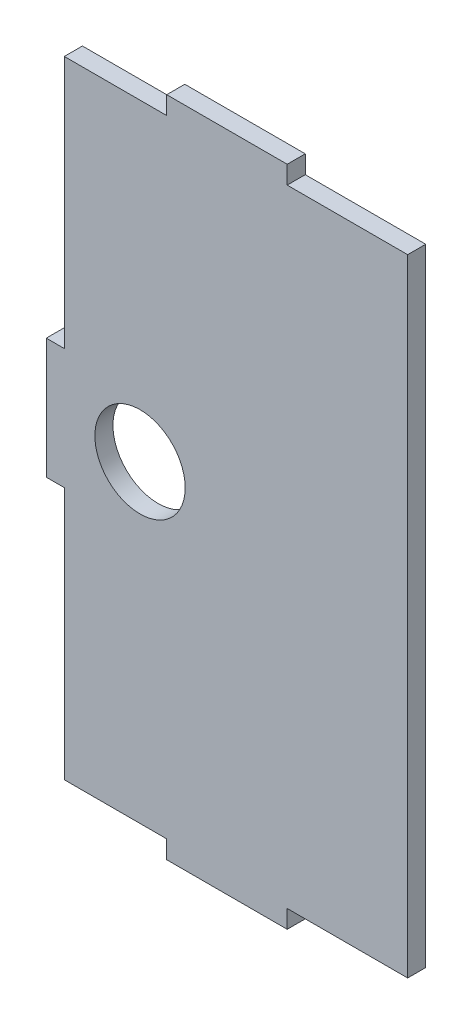
ISO-10303-21;
HEADER;
FILE_DESCRIPTION(('STEP AP214'),'2;1');
FILE_NAME('part.step','',(''),(''),'','','');
FILE_SCHEMA(('AUTOMOTIVE_DESIGN { 1 0 10303 214 1 1 1 1 }'));
ENDSEC;
DATA;
#1=APPLICATION_CONTEXT('core data for automotive mechanical design processes');
#2=APPLICATION_PROTOCOL_DEFINITION('international standard','automotive_design',2000,#1);
#3=PRODUCT_CONTEXT('',#1,'mechanical');
#4=PRODUCT('Part','Part','',(#3));
#5=PRODUCT_RELATED_PRODUCT_CATEGORY('part','',(#4));
#6=PRODUCT_DEFINITION_FORMATION('','',#4);
#7=PRODUCT_DEFINITION_CONTEXT('part definition',#1,'design');
#8=PRODUCT_DEFINITION('design','',#6,#7);
#9=PRODUCT_DEFINITION_SHAPE('','',#8);
#10=(LENGTH_UNIT() NAMED_UNIT(*) SI_UNIT(.MILLI.,.METRE.));
#11=(NAMED_UNIT(*) PLANE_ANGLE_UNIT() SI_UNIT($,.RADIAN.));
#12=(NAMED_UNIT(*) SI_UNIT($,.STERADIAN.) SOLID_ANGLE_UNIT());
#13=UNCERTAINTY_MEASURE_WITH_UNIT(LENGTH_MEASURE(1.E-05),#10,'distance_accuracy_value','');
#14=(GEOMETRIC_REPRESENTATION_CONTEXT(3) GLOBAL_UNCERTAINTY_ASSIGNED_CONTEXT((#13)) GLOBAL_UNIT_ASSIGNED_CONTEXT((#10,
#11,#12)) REPRESENTATION_CONTEXT('',''));
#15=CARTESIAN_POINT('',(0.,0.,0.));
#16=DIRECTION('',(0.,0.,1.));
#17=DIRECTION('',(1.,0.,0.));
#18=AXIS2_PLACEMENT_3D('',#15,#16,#17);
#19=CARTESIAN_POINT('',(-27.,52.,3.));
#20=DIRECTION('',(1.,0.,0.));
#21=DIRECTION('',(0.,1.,0.));
#22=AXIS2_PLACEMENT_3D('',#19,#20,#21);
#23=PLANE('',#22);
#24=DIRECTION('',(0.,0.,1.));
#25=VECTOR('',#24,1.);
#26=CARTESIAN_POINT('',(-27.,-10.,0.));
#27=LINE('',#26,#25);
#28=CARTESIAN_POINT('',(-27.,-10.,0.));
#29=VERTEX_POINT('',#28);
#30=CARTESIAN_POINT('',(-27.,-10.,3.));
#31=VERTEX_POINT('',#30);
#32=EDGE_CURVE('E166',#29,#31,#27,.T.);
#33=ORIENTED_EDGE('',*,*,#32,.F.);
#34=DIRECTION('',(0.,-1.,0.));
#35=VECTOR('',#34,1.);
#36=CARTESIAN_POINT('',(-27.,52.,0.));
#37=LINE('',#36,#35);
#38=CARTESIAN_POINT('',(-27.,-52.,0.));
#39=VERTEX_POINT('',#38);
#40=EDGE_CURVE('E235',#29,#39,#37,.T.);
#41=ORIENTED_EDGE('',*,*,#40,.T.);
#42=DIRECTION('',(0.,0.,-1.));
#43=VECTOR('',#42,1.);
#44=CARTESIAN_POINT('',(-27.,-52.,3.));
#45=LINE('',#44,#43);
#46=CARTESIAN_POINT('',(-27.,-52.,3.));
#47=VERTEX_POINT('',#46);
#48=EDGE_CURVE('E246',#47,#39,#45,.T.);
#49=ORIENTED_EDGE('',*,*,#48,.F.);
#50=DIRECTION('',(0.,-1.,0.));
#51=VECTOR('',#50,1.);
#52=CARTESIAN_POINT('',(-27.,52.,3.));
#53=LINE('',#52,#51);
#54=EDGE_CURVE('E48',#31,#47,#53,.T.);
#55=ORIENTED_EDGE('',*,*,#54,.F.);
#56=EDGE_LOOP('',(#33,#41,#49,#55));
#57=FACE_BOUND('',#56,.T.);
#58=ADVANCED_FACE('F32',(#57),#23,.F.);
#59=DIRECTION('',(0.,0.,-1.));
#60=VECTOR('',#59,1.);
#61=CARTESIAN_POINT('',(-27.,9.99999999999999,0.));
#62=LINE('',#61,#60);
#63=CARTESIAN_POINT('',(-27.,9.99999999999999,3.));
#64=VERTEX_POINT('',#63);
#65=CARTESIAN_POINT('',(-27.,9.99999999999999,0.));
#66=VERTEX_POINT('',#65);
#67=EDGE_CURVE('E56',#64,#66,#62,.T.);
#68=ORIENTED_EDGE('',*,*,#67,.F.);
#69=CARTESIAN_POINT('',(-27.,52.,3.));
#70=VERTEX_POINT('',#69);
#71=EDGE_CURVE('E171',#70,#64,#53,.T.);
#72=ORIENTED_EDGE('',*,*,#71,.F.);
#73=DIRECTION('',(0.,0.,-1.));
#74=VECTOR('',#73,1.);
#75=CARTESIAN_POINT('',(-27.,52.,3.));
#76=LINE('',#75,#74);
#77=CARTESIAN_POINT('',(-27.,52.,0.));
#78=VERTEX_POINT('',#77);
#79=EDGE_CURVE('E249',#70,#78,#76,.T.);
#80=ORIENTED_EDGE('',*,*,#79,.T.);
#81=EDGE_CURVE('E236',#78,#66,#37,.T.);
#82=ORIENTED_EDGE('',*,*,#81,.T.);
#83=EDGE_LOOP('',(#68,#72,#80,#82));
#84=FACE_BOUND('',#83,.T.);
#85=ADVANCED_FACE('F334',(#84),#23,.F.);
#86=CARTESIAN_POINT('',(-10.,-55.,3.));
#87=DIRECTION('',(0.,1.,0.));
#88=DIRECTION('',(0.,0.,1.));
#89=AXIS2_PLACEMENT_3D('',#86,#87,#88);
#90=PLANE('',#89);
#91=DIRECTION('',(1.,0.,0.));
#92=VECTOR('',#91,1.);
#93=CARTESIAN_POINT('',(-10.,-55.,0.));
#94=LINE('',#93,#92);
#95=CARTESIAN_POINT('',(-10.,-55.,0.));
#96=VERTEX_POINT('',#95);
#97=CARTESIAN_POINT('',(10.,-55.,0.));
#98=VERTEX_POINT('',#97);
#99=EDGE_CURVE('E210',#96,#98,#94,.T.);
#100=ORIENTED_EDGE('',*,*,#99,.T.);
#101=DIRECTION('',(0.,0.,-1.));
#102=VECTOR('',#101,1.);
#103=CARTESIAN_POINT('',(10.,-55.,3.));
#104=LINE('',#103,#102);
#105=CARTESIAN_POINT('',(10.,-55.,3.));
#106=VERTEX_POINT('',#105);
#107=EDGE_CURVE('E11',#106,#98,#104,.T.);
#108=ORIENTED_EDGE('',*,*,#107,.F.);
#109=DIRECTION('',(1.,0.,0.));
#110=VECTOR('',#109,1.);
#111=CARTESIAN_POINT('',(-10.,-55.,3.));
#112=LINE('',#111,#110);
#113=CARTESIAN_POINT('',(-10.,-55.,3.));
#114=VERTEX_POINT('',#113);
#115=EDGE_CURVE('E180',#114,#106,#112,.T.);
#116=ORIENTED_EDGE('',*,*,#115,.F.);
#117=DIRECTION('',(0.,0.,-1.));
#118=VECTOR('',#117,1.);
#119=CARTESIAN_POINT('',(-10.,-55.,3.));
#120=LINE('',#119,#118);
#121=EDGE_CURVE('E209',#114,#96,#120,.T.);
#122=ORIENTED_EDGE('',*,*,#121,.T.);
#123=EDGE_LOOP('',(#100,#108,#116,#122));
#124=FACE_BOUND('',#123,.T.);
#125=ADVANCED_FACE('F34',(#124),#90,.F.);
#126=CARTESIAN_POINT('',(10.,-55.,3.));
#127=DIRECTION('',(-1.,0.,0.));
#128=DIRECTION('',(0.,-1.,0.));
#129=AXIS2_PLACEMENT_3D('',#126,#127,#128);
#130=PLANE('',#129);
#131=DIRECTION('',(0.,1.,0.));
#132=VECTOR('',#131,1.);
#133=CARTESIAN_POINT('',(10.,-55.,0.));
#134=LINE('',#133,#132);
#135=CARTESIAN_POINT('',(10.,-52.,0.));
#136=VERTEX_POINT('',#135);
#137=EDGE_CURVE('E213',#98,#136,#134,.T.);
#138=ORIENTED_EDGE('',*,*,#137,.T.);
#139=DIRECTION('',(0.,0.,-1.));
#140=VECTOR('',#139,1.);
#141=CARTESIAN_POINT('',(10.,-52.,3.));
#142=LINE('',#141,#140);
#143=CARTESIAN_POINT('',(10.,-52.,3.));
#144=VERTEX_POINT('',#143);
#145=EDGE_CURVE('E41',#144,#136,#142,.T.);
#146=ORIENTED_EDGE('',*,*,#145,.F.);
#147=DIRECTION('',(0.,1.,0.));
#148=VECTOR('',#147,1.);
#149=CARTESIAN_POINT('',(10.,-55.,3.));
#150=LINE('',#149,#148);
#151=EDGE_CURVE('E182',#106,#144,#150,.T.);
#152=ORIENTED_EDGE('',*,*,#151,.F.);
#153=ORIENTED_EDGE('',*,*,#107,.T.);
#154=EDGE_LOOP('',(#138,#146,#152,#153));
#155=FACE_BOUND('',#154,.T.);
#156=ADVANCED_FACE('F285',(#155),#130,.F.);
#157=CARTESIAN_POINT('',(10.,-52.,3.));
#158=DIRECTION('',(0.,1.,0.));
#159=DIRECTION('',(0.,0.,1.));
#160=AXIS2_PLACEMENT_3D('',#157,#158,#159);
#161=PLANE('',#160);
#162=DIRECTION('',(1.,0.,0.));
#163=VECTOR('',#162,1.);
#164=CARTESIAN_POINT('',(10.,-52.,0.));
#165=LINE('',#164,#163);
#166=CARTESIAN_POINT('',(30.,-52.,0.));
#167=VERTEX_POINT('',#166);
#168=EDGE_CURVE('E215',#136,#167,#165,.T.);
#169=ORIENTED_EDGE('',*,*,#168,.T.);
#170=DIRECTION('',(0.,0.,-1.));
#171=VECTOR('',#170,1.);
#172=CARTESIAN_POINT('',(30.,-52.,3.));
#173=LINE('',#172,#171);
#174=CARTESIAN_POINT('',(30.,-52.,3.));
#175=VERTEX_POINT('',#174);
#176=EDGE_CURVE('E261',#175,#167,#173,.T.);
#177=ORIENTED_EDGE('',*,*,#176,.F.);
#178=DIRECTION('',(1.,0.,0.));
#179=VECTOR('',#178,1.);
#180=CARTESIAN_POINT('',(10.,-52.,3.));
#181=LINE('',#180,#179);
#182=EDGE_CURVE('E185',#144,#175,#181,.T.);
#183=ORIENTED_EDGE('',*,*,#182,.F.);
#184=ORIENTED_EDGE('',*,*,#145,.T.);
#185=EDGE_LOOP('',(#169,#177,#183,#184));
#186=FACE_BOUND('',#185,.T.);
#187=ADVANCED_FACE('F269',(#186),#161,.F.);
#188=CARTESIAN_POINT('',(30.,-52.,3.));
#189=DIRECTION('',(-1.,0.,0.));
#190=DIRECTION('',(0.,0.,1.));
#191=AXIS2_PLACEMENT_3D('',#188,#189,#190);
#192=PLANE('',#191);
#193=DIRECTION('',(0.,1.,0.));
#194=VECTOR('',#193,1.);
#195=CARTESIAN_POINT('',(30.,-52.,0.));
#196=LINE('',#195,#194);
#197=CARTESIAN_POINT('',(30.,52.,0.));
#198=VERTEX_POINT('',#197);
#199=EDGE_CURVE('E217',#167,#198,#196,.T.);
#200=ORIENTED_EDGE('',*,*,#199,.T.);
#201=DIRECTION('',(0.,0.,-1.));
#202=VECTOR('',#201,1.);
#203=CARTESIAN_POINT('',(30.,52.,3.));
#204=LINE('',#203,#202);
#205=CARTESIAN_POINT('',(30.,52.,3.));
#206=VERTEX_POINT('',#205);
#207=EDGE_CURVE('E259',#206,#198,#204,.T.);
#208=ORIENTED_EDGE('',*,*,#207,.F.);
#209=DIRECTION('',(0.,1.,0.));
#210=VECTOR('',#209,1.);
#211=CARTESIAN_POINT('',(30.,-52.,3.));
#212=LINE('',#211,#210);
#213=EDGE_CURVE('E187',#175,#206,#212,.T.);
#214=ORIENTED_EDGE('',*,*,#213,.F.);
#215=ORIENTED_EDGE('',*,*,#176,.T.);
#216=EDGE_LOOP('',(#200,#208,#214,#215));
#217=FACE_BOUND('',#216,.T.);
#218=ADVANCED_FACE('F279',(#217),#192,.F.);
#219=CARTESIAN_POINT('',(10.,52.,3.));
#220=DIRECTION('',(0.,1.,0.));
#221=DIRECTION('',(-1.,0.,0.));
#222=AXIS2_PLACEMENT_3D('',#219,#220,#221);
#223=PLANE('',#222);
#224=DIRECTION('',(1.,0.,0.));
#225=VECTOR('',#224,1.);
#226=CARTESIAN_POINT('',(10.,52.,0.));
#227=LINE('',#226,#225);
#228=CARTESIAN_POINT('',(10.,52.,0.));
#229=VERTEX_POINT('',#228);
#230=EDGE_CURVE('E220',#229,#198,#227,.T.);
#231=ORIENTED_EDGE('',*,*,#230,.F.);
#232=DIRECTION('',(0.,0.,-1.));
#233=VECTOR('',#232,1.);
#234=CARTESIAN_POINT('',(10.,52.,3.));
#235=LINE('',#234,#233);
#236=CARTESIAN_POINT('',(10.,52.,3.));
#237=VERTEX_POINT('',#236);
#238=EDGE_CURVE('E257',#237,#229,#235,.T.);
#239=ORIENTED_EDGE('',*,*,#238,.F.);
#240=DIRECTION('',(1.,0.,0.));
#241=VECTOR('',#240,1.);
#242=CARTESIAN_POINT('',(10.,52.,3.));
#243=LINE('',#242,#241);
#244=EDGE_CURVE('E189',#237,#206,#243,.T.);
#245=ORIENTED_EDGE('',*,*,#244,.T.);
#246=ORIENTED_EDGE('',*,*,#207,.T.);
#247=EDGE_LOOP('',(#231,#239,#245,#246));
#248=FACE_BOUND('',#247,.T.);
#249=ADVANCED_FACE('F324',(#248),#223,.T.);
#250=CARTESIAN_POINT('',(10.,55.,3.));
#251=DIRECTION('',(1.,0.,0.));
#252=DIRECTION('',(0.,1.,0.));
#253=AXIS2_PLACEMENT_3D('',#250,#251,#252);
#254=PLANE('',#253);
#255=DIRECTION('',(0.,-1.,0.));
#256=VECTOR('',#255,1.);
#257=CARTESIAN_POINT('',(10.,55.,0.));
#258=LINE('',#257,#256);
#259=CARTESIAN_POINT('',(10.,55.,0.));
#260=VERTEX_POINT('',#259);
#261=EDGE_CURVE('E223',#260,#229,#258,.T.);
#262=ORIENTED_EDGE('',*,*,#261,.F.);
#263=DIRECTION('',(0.,0.,-1.));
#264=VECTOR('',#263,1.);
#265=CARTESIAN_POINT('',(10.,55.,3.));
#266=LINE('',#265,#264);
#267=CARTESIAN_POINT('',(10.,55.,3.));
#268=VERTEX_POINT('',#267);
#269=EDGE_CURVE('E255',#268,#260,#266,.T.);
#270=ORIENTED_EDGE('',*,*,#269,.F.);
#271=DIRECTION('',(0.,-1.,0.));
#272=VECTOR('',#271,1.);
#273=CARTESIAN_POINT('',(10.,55.,3.));
#274=LINE('',#273,#272);
#275=EDGE_CURVE('E192',#268,#237,#274,.T.);
#276=ORIENTED_EDGE('',*,*,#275,.T.);
#277=ORIENTED_EDGE('',*,*,#238,.T.);
#278=EDGE_LOOP('',(#262,#270,#276,#277));
#279=FACE_BOUND('',#278,.T.);
#280=ADVANCED_FACE('F322',(#279),#254,.T.);
#281=CARTESIAN_POINT('',(-10.,55.,3.));
#282=DIRECTION('',(0.,1.,0.));
#283=DIRECTION('',(0.,0.,1.));
#284=AXIS2_PLACEMENT_3D('',#281,#282,#283);
#285=PLANE('',#284);
#286=DIRECTION('',(1.,0.,0.));
#287=VECTOR('',#286,1.);
#288=CARTESIAN_POINT('',(-10.,55.,0.));
#289=LINE('',#288,#287);
#290=CARTESIAN_POINT('',(-10.,55.,0.));
#291=VERTEX_POINT('',#290);
#292=EDGE_CURVE('E226',#291,#260,#289,.T.);
#293=ORIENTED_EDGE('',*,*,#292,.F.);
#294=DIRECTION('',(0.,0.,-1.));
#295=VECTOR('',#294,1.);
#296=CARTESIAN_POINT('',(-10.,55.,3.));
#297=LINE('',#296,#295);
#298=CARTESIAN_POINT('',(-10.,55.,3.));
#299=VERTEX_POINT('',#298);
#300=EDGE_CURVE('E253',#299,#291,#297,.T.);
#301=ORIENTED_EDGE('',*,*,#300,.F.);
#302=DIRECTION('',(1.,0.,0.));
#303=VECTOR('',#302,1.);
#304=CARTESIAN_POINT('',(-10.,55.,3.));
#305=LINE('',#304,#303);
#306=EDGE_CURVE('E195',#299,#268,#305,.T.);
#307=ORIENTED_EDGE('',*,*,#306,.T.);
#308=ORIENTED_EDGE('',*,*,#269,.T.);
#309=EDGE_LOOP('',(#293,#301,#307,#308));
#310=FACE_BOUND('',#309,.T.);
#311=ADVANCED_FACE('F319',(#310),#285,.T.);
#312=CARTESIAN_POINT('',(-10.,52.,3.));
#313=DIRECTION('',(-1.,0.,0.));
#314=DIRECTION('',(0.,0.,1.));
#315=AXIS2_PLACEMENT_3D('',#312,#313,#314);
#316=PLANE('',#315);
#317=DIRECTION('',(0.,1.,0.));
#318=VECTOR('',#317,1.);
#319=CARTESIAN_POINT('',(-10.,52.,0.));
#320=LINE('',#319,#318);
#321=CARTESIAN_POINT('',(-10.,52.,0.));
#322=VERTEX_POINT('',#321);
#323=EDGE_CURVE('E229',#322,#291,#320,.T.);
#324=ORIENTED_EDGE('',*,*,#323,.F.);
#325=DIRECTION('',(0.,0.,-1.));
#326=VECTOR('',#325,1.);
#327=CARTESIAN_POINT('',(-10.,52.,3.));
#328=LINE('',#327,#326);
#329=CARTESIAN_POINT('',(-10.,52.,3.));
#330=VERTEX_POINT('',#329);
#331=EDGE_CURVE('E251',#330,#322,#328,.T.);
#332=ORIENTED_EDGE('',*,*,#331,.F.);
#333=DIRECTION('',(0.,1.,0.));
#334=VECTOR('',#333,1.);
#335=CARTESIAN_POINT('',(-10.,52.,3.));
#336=LINE('',#335,#334);
#337=EDGE_CURVE('E198',#330,#299,#336,.T.);
#338=ORIENTED_EDGE('',*,*,#337,.T.);
#339=ORIENTED_EDGE('',*,*,#300,.T.);
#340=EDGE_LOOP('',(#324,#332,#338,#339));
#341=FACE_BOUND('',#340,.T.);
#342=ADVANCED_FACE('F315',(#341),#316,.T.);
#343=CARTESIAN_POINT('',(-27.,52.,3.));
#344=DIRECTION('',(0.,1.,0.));
#345=DIRECTION('',(-1.,0.,0.));
#346=AXIS2_PLACEMENT_3D('',#343,#344,#345);
#347=PLANE('',#346);
#348=DIRECTION('',(1.,0.,0.));
#349=VECTOR('',#348,1.);
#350=CARTESIAN_POINT('',(-27.,52.,0.));
#351=LINE('',#350,#349);
#352=EDGE_CURVE('E232',#78,#322,#351,.T.);
#353=ORIENTED_EDGE('',*,*,#352,.F.);
#354=ORIENTED_EDGE('',*,*,#79,.F.);
#355=DIRECTION('',(1.,0.,0.));
#356=VECTOR('',#355,1.);
#357=CARTESIAN_POINT('',(-27.,52.,3.));
#358=LINE('',#357,#356);
#359=EDGE_CURVE('E201',#70,#330,#358,.T.);
#360=ORIENTED_EDGE('',*,*,#359,.T.);
#361=ORIENTED_EDGE('',*,*,#331,.T.);
#362=EDGE_LOOP('',(#353,#354,#360,#361));
#363=FACE_BOUND('',#362,.T.);
#364=ADVANCED_FACE('F311',(#363),#347,.T.);
#365=CARTESIAN_POINT('',(-27.,-52.,3.));
#366=DIRECTION('',(0.,1.,0.));
#367=DIRECTION('',(-1.,0.,0.));
#368=AXIS2_PLACEMENT_3D('',#365,#366,#367);
#369=PLANE('',#368);
#370=DIRECTION('',(1.,0.,0.));
#371=VECTOR('',#370,1.);
#372=CARTESIAN_POINT('',(-27.,-52.,0.));
#373=LINE('',#372,#371);
#374=CARTESIAN_POINT('',(-10.,-52.,0.));
#375=VERTEX_POINT('',#374);
#376=EDGE_CURVE('E238',#39,#375,#373,.T.);
#377=ORIENTED_EDGE('',*,*,#376,.T.);
#378=DIRECTION('',(0.,0.,-1.));
#379=VECTOR('',#378,1.);
#380=CARTESIAN_POINT('',(-10.,-52.,3.));
#381=LINE('',#380,#379);
#382=CARTESIAN_POINT('',(-10.,-52.,3.));
#383=VERTEX_POINT('',#382);
#384=EDGE_CURVE('E243',#383,#375,#381,.T.);
#385=ORIENTED_EDGE('',*,*,#384,.F.);
#386=DIRECTION('',(1.,0.,0.));
#387=VECTOR('',#386,1.);
#388=CARTESIAN_POINT('',(-27.,-52.,3.));
#389=LINE('',#388,#387);
#390=EDGE_CURVE('E205',#47,#383,#389,.T.);
#391=ORIENTED_EDGE('',*,*,#390,.F.);
#392=ORIENTED_EDGE('',*,*,#48,.T.);
#393=EDGE_LOOP('',(#377,#385,#391,#392));
#394=FACE_BOUND('',#393,.T.);
#395=ADVANCED_FACE('F297',(#394),#369,.F.);
#396=CARTESIAN_POINT('',(-10.,-52.,3.));
#397=DIRECTION('',(1.,0.,0.));
#398=DIRECTION('',(0.,0.,-1.));
#399=AXIS2_PLACEMENT_3D('',#396,#397,#398);
#400=PLANE('',#399);
#401=DIRECTION('',(0.,-1.,0.));
#402=VECTOR('',#401,1.);
#403=CARTESIAN_POINT('',(-10.,-52.,0.));
#404=LINE('',#403,#402);
#405=EDGE_CURVE('E183',#375,#96,#404,.T.);
#406=ORIENTED_EDGE('',*,*,#405,.T.);
#407=ORIENTED_EDGE('',*,*,#121,.F.);
#408=DIRECTION('',(0.,-1.,0.));
#409=VECTOR('',#408,1.);
#410=CARTESIAN_POINT('',(-10.,-52.,3.));
#411=LINE('',#410,#409);
#412=EDGE_CURVE('E207',#383,#114,#411,.T.);
#413=ORIENTED_EDGE('',*,*,#412,.F.);
#414=ORIENTED_EDGE('',*,*,#384,.T.);
#415=EDGE_LOOP('',(#406,#407,#413,#414));
#416=FACE_BOUND('',#415,.T.);
#417=ADVANCED_FACE('F292',(#416),#400,.F.);
#418=CARTESIAN_POINT('',(0.,0.,3.));
#419=DIRECTION('',(0.,0.,1.));
#420=DIRECTION('',(1.,0.,0.));
#421=AXIS2_PLACEMENT_3D('',#418,#419,#420);
#422=PLANE('',#421);
#423=CARTESIAN_POINT('',(-14.4328586622917,0.,3.));
#424=DIRECTION('',(0.,0.,1.));
#425=DIRECTION('',(1.,0.,0.));
#426=AXIS2_PLACEMENT_3D('',#423,#424,#425);
#427=CIRCLE('',#426,7.5);
#428=CARTESIAN_POINT('',(-6.9328586622917,0.,3.));
#429=VERTEX_POINT('',#428);
#430=EDGE_CURVE('E172',#429,#429,#427,.T.);
#431=ORIENTED_EDGE('',*,*,#430,.F.);
#432=EDGE_LOOP('',(#431));
#433=FACE_BOUND('',#432,.T.);
#434=ORIENTED_EDGE('',*,*,#115,.T.);
#435=ORIENTED_EDGE('',*,*,#151,.T.);
#436=ORIENTED_EDGE('',*,*,#182,.T.);
#437=ORIENTED_EDGE('',*,*,#213,.T.);
#438=ORIENTED_EDGE('',*,*,#244,.F.);
#439=ORIENTED_EDGE('',*,*,#275,.F.);
#440=ORIENTED_EDGE('',*,*,#306,.F.);
#441=ORIENTED_EDGE('',*,*,#337,.F.);
#442=ORIENTED_EDGE('',*,*,#359,.F.);
#443=ORIENTED_EDGE('',*,*,#71,.T.);
#444=DIRECTION('',(1.,0.,0.));
#445=VECTOR('',#444,1.);
#446=CARTESIAN_POINT('',(-30.,9.99999999999999,3.));
#447=LINE('',#446,#445);
#448=CARTESIAN_POINT('',(-30.,9.99999999999999,3.));
#449=VERTEX_POINT('',#448);
#450=EDGE_CURVE('E151',#449,#64,#447,.T.);
#451=ORIENTED_EDGE('',*,*,#450,.F.);
#452=DIRECTION('',(0.,1.,0.));
#453=VECTOR('',#452,1.);
#454=CARTESIAN_POINT('',(-30.,-10.,3.));
#455=LINE('',#454,#453);
#456=CARTESIAN_POINT('',(-30.,-10.,3.));
#457=VERTEX_POINT('',#456);
#458=EDGE_CURVE('E157',#457,#449,#455,.T.);
#459=ORIENTED_EDGE('',*,*,#458,.F.);
#460=DIRECTION('',(1.,0.,0.));
#461=VECTOR('',#460,1.);
#462=CARTESIAN_POINT('',(-30.,-10.,3.));
#463=LINE('',#462,#461);
#464=EDGE_CURVE('E302',#457,#31,#463,.T.);
#465=ORIENTED_EDGE('',*,*,#464,.T.);
#466=ORIENTED_EDGE('',*,*,#54,.T.);
#467=ORIENTED_EDGE('',*,*,#390,.T.);
#468=ORIENTED_EDGE('',*,*,#412,.T.);
#469=EDGE_LOOP('',(#434,#435,#436,#437,#438,#439,#440,#441,#442,#443,#451,#459,#465,#466,#467,#468));
#470=FACE_BOUND('',#469,.T.);
#471=ADVANCED_FACE('F169',(#433,#470),#422,.T.);
#472=CARTESIAN_POINT('',(0.,0.,0.));
#473=DIRECTION('',(0.,0.,1.));
#474=DIRECTION('',(1.,0.,0.));
#475=AXIS2_PLACEMENT_3D('',#472,#473,#474);
#476=PLANE('',#475);
#477=CARTESIAN_POINT('',(-14.4328586622917,0.,0.));
#478=DIRECTION('',(0.,0.,1.));
#479=DIRECTION('',(1.,0.,0.));
#480=AXIS2_PLACEMENT_3D('',#477,#478,#479);
#481=CIRCLE('',#480,7.5);
#482=CARTESIAN_POINT('',(-6.9328586622917,0.,0.));
#483=VERTEX_POINT('',#482);
#484=EDGE_CURVE('E36',#483,#483,#481,.T.);
#485=ORIENTED_EDGE('',*,*,#484,.T.);
#486=EDGE_LOOP('',(#485));
#487=FACE_BOUND('',#486,.T.);
#488=ORIENTED_EDGE('',*,*,#99,.F.);
#489=ORIENTED_EDGE('',*,*,#405,.F.);
#490=ORIENTED_EDGE('',*,*,#376,.F.);
#491=ORIENTED_EDGE('',*,*,#40,.F.);
#492=DIRECTION('',(1.,0.,0.));
#493=VECTOR('',#492,1.);
#494=CARTESIAN_POINT('',(-30.,-10.,0.));
#495=LINE('',#494,#493);
#496=CARTESIAN_POINT('',(-30.,-10.,0.));
#497=VERTEX_POINT('',#496);
#498=EDGE_CURVE('E176',#497,#29,#495,.T.);
#499=ORIENTED_EDGE('',*,*,#498,.F.);
#500=DIRECTION('',(0.,-1.,0.));
#501=VECTOR('',#500,1.);
#502=CARTESIAN_POINT('',(-30.,-10.,0.));
#503=LINE('',#502,#501);
#504=CARTESIAN_POINT('',(-30.,9.99999999999999,0.));
#505=VERTEX_POINT('',#504);
#506=EDGE_CURVE('E156',#505,#497,#503,.T.);
#507=ORIENTED_EDGE('',*,*,#506,.F.);
#508=DIRECTION('',(1.,0.,0.));
#509=VECTOR('',#508,1.);
#510=CARTESIAN_POINT('',(-30.,9.99999999999999,0.));
#511=LINE('',#510,#509);
#512=EDGE_CURVE('E153',#505,#66,#511,.T.);
#513=ORIENTED_EDGE('',*,*,#512,.T.);
#514=ORIENTED_EDGE('',*,*,#81,.F.);
#515=ORIENTED_EDGE('',*,*,#352,.T.);
#516=ORIENTED_EDGE('',*,*,#323,.T.);
#517=ORIENTED_EDGE('',*,*,#292,.T.);
#518=ORIENTED_EDGE('',*,*,#261,.T.);
#519=ORIENTED_EDGE('',*,*,#230,.T.);
#520=ORIENTED_EDGE('',*,*,#199,.F.);
#521=ORIENTED_EDGE('',*,*,#168,.F.);
#522=ORIENTED_EDGE('',*,*,#137,.F.);
#523=EDGE_LOOP('',(#488,#489,#490,#491,#499,#507,#513,#514,#515,#516,#517,#518,#519,#520,#521,#522));
#524=FACE_BOUND('',#523,.T.);
#525=ADVANCED_FACE('F275',(#487,#524),#476,.F.);
#526=CARTESIAN_POINT('',(-14.4328586622917,0.,-7.));
#527=DIRECTION('',(0.,0.,1.));
#528=DIRECTION('',(1.,0.,0.));
#529=AXIS2_PLACEMENT_3D('',#526,#527,#528);
#530=CYLINDRICAL_SURFACE('',#529,7.5);
#531=ORIENTED_EDGE('',*,*,#430,.T.);
#532=EDGE_LOOP('',(#531));
#533=FACE_BOUND('',#532,.T.);
#534=ORIENTED_EDGE('',*,*,#484,.F.);
#535=EDGE_LOOP('',(#534));
#536=FACE_BOUND('',#535,.T.);
#537=ADVANCED_FACE('F384',(#533,#536),#530,.F.);
#538=CARTESIAN_POINT('',(-30.,9.99999999999999,0.));
#539=DIRECTION('',(0.,-1.,0.));
#540=DIRECTION('',(1.,0.,0.));
#541=AXIS2_PLACEMENT_3D('',#538,#539,#540);
#542=PLANE('',#541);
#543=ORIENTED_EDGE('',*,*,#67,.T.);
#544=ORIENTED_EDGE('',*,*,#512,.F.);
#545=DIRECTION('',(0.,0.,-1.));
#546=VECTOR('',#545,1.);
#547=CARTESIAN_POINT('',(-30.,9.99999999999999,0.));
#548=LINE('',#547,#546);
#549=EDGE_CURVE('E147',#449,#505,#548,.T.);
#550=ORIENTED_EDGE('',*,*,#549,.F.);
#551=ORIENTED_EDGE('',*,*,#450,.T.);
#552=EDGE_LOOP('',(#543,#544,#550,#551));
#553=FACE_BOUND('',#552,.T.);
#554=ADVANCED_FACE('F149',(#553),#542,.F.);
#555=CARTESIAN_POINT('',(-30.,-10.,0.));
#556=DIRECTION('',(0.,1.,0.));
#557=DIRECTION('',(-1.,0.,0.));
#558=AXIS2_PLACEMENT_3D('',#555,#556,#557);
#559=PLANE('',#558);
#560=ORIENTED_EDGE('',*,*,#32,.T.);
#561=ORIENTED_EDGE('',*,*,#464,.F.);
#562=DIRECTION('',(0.,0.,1.));
#563=VECTOR('',#562,1.);
#564=CARTESIAN_POINT('',(-30.,-10.,0.));
#565=LINE('',#564,#563);
#566=EDGE_CURVE('E162',#497,#457,#565,.T.);
#567=ORIENTED_EDGE('',*,*,#566,.F.);
#568=ORIENTED_EDGE('',*,*,#498,.T.);
#569=EDGE_LOOP('',(#560,#561,#567,#568));
#570=FACE_BOUND('',#569,.T.);
#571=ADVANCED_FACE('F301',(#570),#559,.F.);
#572=CARTESIAN_POINT('',(-30.,0.,0.));
#573=DIRECTION('',(1.,0.,0.));
#574=DIRECTION('',(0.,0.,-1.));
#575=AXIS2_PLACEMENT_3D('',#572,#573,#574);
#576=PLANE('',#575);
#577=ORIENTED_EDGE('',*,*,#458,.T.);
#578=ORIENTED_EDGE('',*,*,#549,.T.);
#579=ORIENTED_EDGE('',*,*,#506,.T.);
#580=ORIENTED_EDGE('',*,*,#566,.T.);
#581=EDGE_LOOP('',(#577,#578,#579,#580));
#582=FACE_BOUND('',#581,.T.);
#583=ADVANCED_FACE('F160',(#582),#576,.F.);
#584=CLOSED_SHELL('',(#58,#85,#125,#156,#187,#218,#249,#280,#311,#342,#364,#395,#417,#471,#525,
#537,#554,#571,#583));
#585=MANIFOLD_SOLID_BREP('B2',#584);
#586=ADVANCED_BREP_SHAPE_REPRESENTATION('',(#18,#585),#14);
#587=SHAPE_DEFINITION_REPRESENTATION(#9,#586);
ENDSEC;
END-ISO-10303-21;
